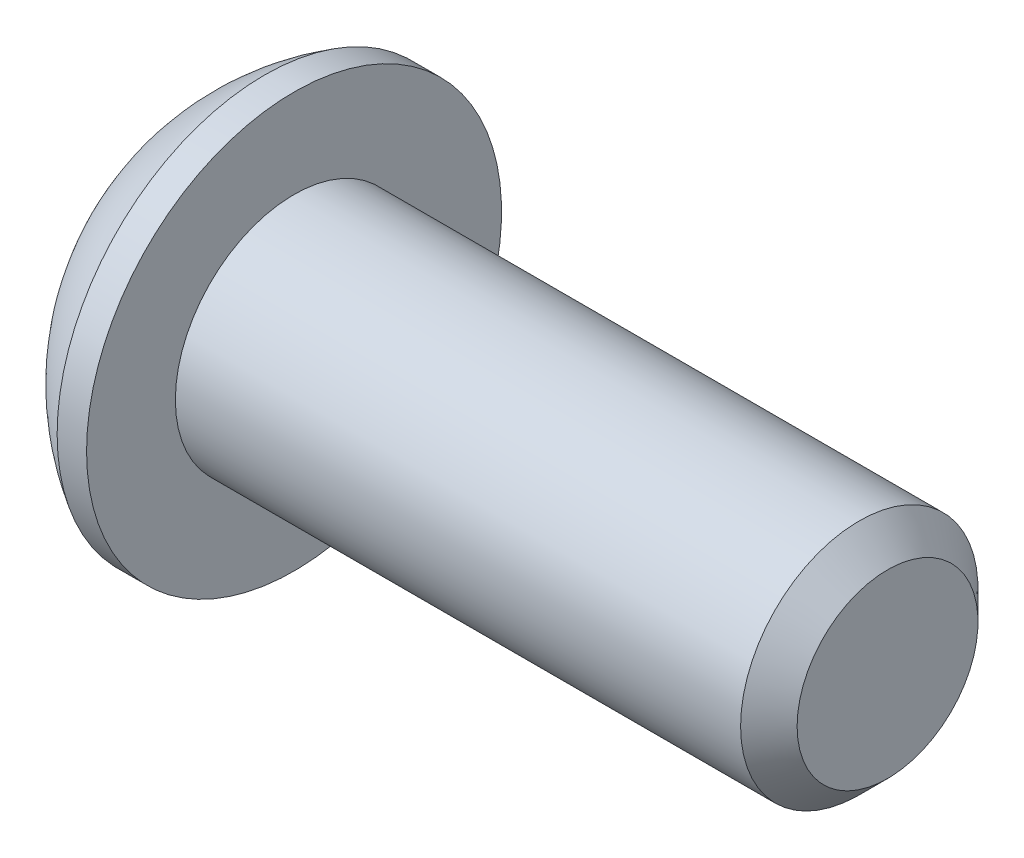
ISO-10303-21;
HEADER;
FILE_DESCRIPTION(('STEP AP214'),'2;1');
FILE_NAME('part.step','',(''),(''),'','','');
FILE_SCHEMA(('AUTOMOTIVE_DESIGN { 1 0 10303 214 1 1 1 1 }'));
ENDSEC;
DATA;
#1=APPLICATION_CONTEXT('core data for automotive mechanical design processes');
#2=APPLICATION_PROTOCOL_DEFINITION('international standard','automotive_design',2000,#1);
#3=PRODUCT_CONTEXT('',#1,'mechanical');
#4=PRODUCT('Part','Part','',(#3));
#5=PRODUCT_RELATED_PRODUCT_CATEGORY('part','',(#4));
#6=PRODUCT_DEFINITION_FORMATION('','',#4);
#7=PRODUCT_DEFINITION_CONTEXT('part definition',#1,'design');
#8=PRODUCT_DEFINITION('design','',#6,#7);
#9=PRODUCT_DEFINITION_SHAPE('','',#8);
#10=(LENGTH_UNIT() NAMED_UNIT(*) SI_UNIT(.MILLI.,.METRE.));
#11=(NAMED_UNIT(*) PLANE_ANGLE_UNIT() SI_UNIT($,.RADIAN.));
#12=(NAMED_UNIT(*) SI_UNIT($,.STERADIAN.) SOLID_ANGLE_UNIT());
#13=UNCERTAINTY_MEASURE_WITH_UNIT(LENGTH_MEASURE(1.E-05),#10,'distance_accuracy_value','');
#14=(GEOMETRIC_REPRESENTATION_CONTEXT(3) GLOBAL_UNCERTAINTY_ASSIGNED_CONTEXT((#13)) GLOBAL_UNIT_ASSIGNED_CONTEXT((#10,
#11,#12)) REPRESENTATION_CONTEXT('',''));
#15=CARTESIAN_POINT('',(0.,0.,0.));
#16=DIRECTION('',(0.,0.,1.));
#17=DIRECTION('',(1.,0.,0.));
#18=AXIS2_PLACEMENT_3D('',#15,#16,#17);
#19=CARTESIAN_POINT('',(0.,0.,0.));
#20=DIRECTION('',(-1.,0.,0.));
#21=DIRECTION('',(0.,0.,1.));
#22=AXIS2_PLACEMENT_3D('',#19,#20,#21);
#23=PLANE('',#22);
#24=CARTESIAN_POINT('',(0.,0.,0.));
#25=DIRECTION('',(-1.,0.,0.));
#26=DIRECTION('',(0.,0.,1.));
#27=AXIS2_PLACEMENT_3D('',#24,#25,#26);
#28=CIRCLE('',#27,2.77495);
#29=CARTESIAN_POINT('',(0.,2.77495,0.));
#30=VERTEX_POINT('',#29);
#31=EDGE_CURVE('E11',#30,#30,#28,.T.);
#32=ORIENTED_EDGE('',*,*,#31,.T.);
#33=EDGE_LOOP('',(#32));
#34=FACE_BOUND('',#33,.T.);
#35=DIRECTION('',(0.,-1.,0.));
#36=VECTOR('',#35,1.);
#37=CARTESIAN_POINT('',(0.,-1.14384635331849,1.9812));
#38=LINE('',#37,#36);
#39=CARTESIAN_POINT('',(0.,1.14384635331849,1.9812));
#40=VERTEX_POINT('',#39);
#41=CARTESIAN_POINT('',(0.,-1.14384635331849,1.9812));
#42=VERTEX_POINT('',#41);
#43=EDGE_CURVE('E49',#40,#42,#38,.T.);
#44=ORIENTED_EDGE('',*,*,#43,.T.);
#45=DIRECTION('',(0.,-0.5,-0.866025403784439));
#46=VECTOR('',#45,1.);
#47=CARTESIAN_POINT('',(0.,-2.28769270663697,0.));
#48=LINE('',#47,#46);
#49=CARTESIAN_POINT('',(0.,-2.28769270663697,0.));
#50=VERTEX_POINT('',#49);
#51=EDGE_CURVE('E367',#42,#50,#48,.T.);
#52=ORIENTED_EDGE('',*,*,#51,.T.);
#53=DIRECTION('',(0.,0.5,-0.866025403784439));
#54=VECTOR('',#53,1.);
#55=CARTESIAN_POINT('',(0.,-1.14384635331849,-1.9812));
#56=LINE('',#55,#54);
#57=CARTESIAN_POINT('',(0.,-1.14384635331849,-1.9812));
#58=VERTEX_POINT('',#57);
#59=EDGE_CURVE('E129',#50,#58,#56,.T.);
#60=ORIENTED_EDGE('',*,*,#59,.T.);
#61=DIRECTION('',(0.,1.,0.));
#62=VECTOR('',#61,1.);
#63=CARTESIAN_POINT('',(0.,1.14384635331849,-1.9812));
#64=LINE('',#63,#62);
#65=CARTESIAN_POINT('',(0.,1.14384635331849,-1.9812));
#66=VERTEX_POINT('',#65);
#67=EDGE_CURVE('E370',#58,#66,#64,.T.);
#68=ORIENTED_EDGE('',*,*,#67,.T.);
#69=DIRECTION('',(0.,0.5,0.866025403784439));
#70=VECTOR('',#69,1.);
#71=CARTESIAN_POINT('',(0.,2.28769270663697,0.));
#72=LINE('',#71,#70);
#73=CARTESIAN_POINT('',(0.,2.28769270663697,0.));
#74=VERTEX_POINT('',#73);
#75=EDGE_CURVE('E372',#66,#74,#72,.T.);
#76=ORIENTED_EDGE('',*,*,#75,.T.);
#77=DIRECTION('',(0.,-0.5,0.866025403784439));
#78=VECTOR('',#77,1.);
#79=CARTESIAN_POINT('',(0.,1.14384635331849,1.9812));
#80=LINE('',#79,#78);
#81=EDGE_CURVE('E374',#74,#40,#80,.T.);
#82=ORIENTED_EDGE('',*,*,#81,.T.);
#83=EDGE_LOOP('',(#44,#52,#60,#68,#76,#82));
#84=FACE_BOUND('',#83,.T.);
#85=ADVANCED_FACE('F35',(#34,#84),#23,.T.);
#86=CARTESIAN_POINT('',(5.78512506188119,0.,0.));
#87=DIRECTION('',(-1.,0.,0.));
#88=DIRECTION('',(0.,1.,0.));
#89=AXIS2_PLACEMENT_3D('',#86,#87,#88);
#90=SPHERICAL_SURFACE('',#89,6.41623094067739);
#91=CARTESIAN_POINT('',(2.5654,0.,0.));
#92=DIRECTION('',(-1.,0.,0.));
#93=DIRECTION('',(0.,0.,1.));
#94=AXIS2_PLACEMENT_3D('',#91,#92,#93);
#95=CIRCLE('',#94,5.5499);
#96=CARTESIAN_POINT('',(2.5654,5.5499,0.));
#97=VERTEX_POINT('',#96);
#98=EDGE_CURVE('E42',#97,#97,#95,.T.);
#99=CARTESIAN_POINT('',(2.5654,5.5499,0.));
#100=CARTESIAN_POINT('',(2.53083708566419,5.52984868712258,0.));
#101=CARTESIAN_POINT('',(2.49646152825914,5.50947442663449,0.));
#102=CARTESIAN_POINT('',(2.42809701945272,5.4680872977392,0.));
#103=CARTESIAN_POINT('',(2.39410806805135,5.447074429332,0.));
#104=CARTESIAN_POINT('',(2.32652866339446,5.40441737190071,0.));
#105=CARTESIAN_POINT('',(2.29293821013895,5.38277318287661,0.));
#106=CARTESIAN_POINT('',(2.22616751866502,5.33886105159856,0.));
#107=CARTESIAN_POINT('',(2.19298728044662,5.3165931093446,0.));
#108=CARTESIAN_POINT('',(2.12704860244366,5.27144124070729,0.));
#109=CARTESIAN_POINT('',(2.09429016265912,5.24855731432393,0.));
#110=CARTESIAN_POINT('',(2.02920651509859,5.20218146582175,0.));
#111=CARTESIAN_POINT('',(1.99688130732261,5.17868954370292,0.));
#112=CARTESIAN_POINT('',(1.93267540683267,5.13110590319174,0.));
#113=CARTESIAN_POINT('',(1.90079471411871,5.10701418479938,0.));
#114=CARTESIAN_POINT('',(1.83748897146475,5.05823936086598,0.));
#115=CARTESIAN_POINT('',(1.80606392152475,5.03355625532495,0.));
#116=CARTESIAN_POINT('',(1.74368043314138,4.98360727255644,0.));
#117=CARTESIAN_POINT('',(1.71272199469802,4.95834139532897,0.));
#118=CARTESIAN_POINT('',(1.65128253514951,4.90723568808467,0.));
#119=CARTESIAN_POINT('',(1.62080151404435,4.88139585806785,0.));
#120=CARTESIAN_POINT('',(1.56032752837792,4.82915126447052,0.));
#121=CARTESIAN_POINT('',(1.53033456381665,4.80274650089003,0.));
#122=CARTESIAN_POINT('',(1.4708471600897,4.74938125657909,0.));
#123=CARTESIAN_POINT('',(1.44135272092403,4.72242077584864,0.));
#124=CARTESIAN_POINT('',(1.38287266283316,4.66795350762059,0.));
#125=CARTESIAN_POINT('',(1.35388704390797,4.64044672012299,0.));
#126=CARTESIAN_POINT('',(1.29643474354244,4.58489643942841,0.));
#127=CARTESIAN_POINT('',(1.26796806210209,4.55685294623144,0.));
#128=CARTESIAN_POINT('',(1.21156357281885,4.50023904253955,0.));
#129=CARTESIAN_POINT('',(1.18362576497595,4.47166863204464,0.));
#130=CARTESIAN_POINT('',(1.12828877440023,4.41401086607543,0.));
#131=CARTESIAN_POINT('',(1.10088959166741,4.38492351060113,0.));
#132=CARTESIAN_POINT('',(1.04663941482087,4.32624200742801,0.));
#133=CARTESIAN_POINT('',(1.01978842070714,4.2966478597292,0.));
#134=CARTESIAN_POINT('',(0.966643993266069,4.2369631017545,0.));
#135=CARTESIAN_POINT('',(0.94035055993872,4.20687249147862,0.));
#136=CARTESIAN_POINT('',(0.888330431624668,4.14620531128432,0.));
#137=CARTESIAN_POINT('',(0.862603736637966,4.11562874136591,0.));
#138=CARTESIAN_POINT('',(0.811726064743087,4.05400031444217,0.));
#139=CARTESIAN_POINT('',(0.786575087834911,4.02294845743684,0.));
#140=CARTESIAN_POINT('',(0.736857630884291,3.96038029479081,0.));
#141=CARTESIAN_POINT('',(0.712291150841848,3.9288639891501,0.));
#142=CARTESIAN_POINT('',(0.6637512623949,3.8653779297977,0.));
#143=CARTESIAN_POINT('',(0.639777853990396,3.833408176086,0.));
#144=CARTESIAN_POINT('',(0.592432476584127,3.76902637942894,0.));
#145=CARTESIAN_POINT('',(0.569060507582362,3.73661433648358,0.));
#146=CARTESIAN_POINT('',(0.522926166816147,3.67135927457555,0.));
#147=CARTESIAN_POINT('',(0.500163795051696,3.63851625561289,0.));
#148=CARTESIAN_POINT('',(0.455256593824864,3.57241070531295,0.));
#149=CARTESIAN_POINT('',(0.433111764362482,3.53914817397566,0.));
#150=CARTESIAN_POINT('',(0.389447377232278,3.47221520900886,0.));
#151=CARTESIAN_POINT('',(0.367927819564456,3.43854477537934,0.));
#152=CARTESIAN_POINT('',(0.325521487354906,3.37080775824281,0.));
#153=CARTESIAN_POINT('',(0.304634712813178,3.3367411747358,0.));
#154=CARTESIAN_POINT('',(0.263501236996927,3.26822374869429,0.));
#155=CARTESIAN_POINT('',(0.243254535722403,3.23377290615979,0.));
#156=CARTESIAN_POINT('',(0.203408274368182,3.16449898643303,0.));
#157=CARTESIAN_POINT('',(0.183808714288484,3.12967590924077,0.));
#158=CARTESIAN_POINT('',(0.14526357289266,3.05966967674634,0.));
#159=CARTESIAN_POINT('',(0.126317991576534,3.02448652144419,0.));
#160=CARTESIAN_POINT('',(0.089087433723099,2.95377240655615,0.));
#161=CARTESIAN_POINT('',(0.0708024571857911,2.91824144697028,0.));
#162=CARTESIAN_POINT('',(0.0348994419493881,2.84684415010637,0.));
#163=CARTESIAN_POINT('',(0.017281403250293,2.81097781282834,0.));
#164=CARTESIAN_POINT('',(0.,2.77495,0.));
#165=B_SPLINE_CURVE_WITH_KNOTS('',3,(#99,#100,#101,#102,#103,#104,#105,#106,#107,#108,#109,#110,
#111,#112,#113,#114,#115,#116,#117,#118,#119,#120,#121,#122,#123,#124,#125,#126,#127,#128,#129,
#130,#131,#132,#133,#134,#135,#136,#137,#138,#139,#140,#141,#142,#143,#144,#145,#146,#147,#148,
#149,#150,#151,#152,#153,#154,#155,#156,#157,#158,#159,#160,#161,#162,#163,#164),.UNSPECIFIED.,
.F.,.F.,(4,2,2,2,2,2,2,2,2,2,2,2,2,2,2,2,2,2,2,2,2,2,2,2,2,2,2,2,2,2,2,2,4),(0.,
0.119872570538484,0.239745141076968,0.359617711615453,0.479490282153937,0.599362852692421,
0.719235423230905,0.83910799376939,0.958980564307873,1.07885313484636,1.19872570538484,
1.31859827592333,1.43847084646181,1.55834341700029,1.67821598753878,1.79808855807726,
1.91796112861575,2.03783369915423,2.15770626969271,2.2775788402312,2.39745141076968,
2.51732398130817,2.63719655184665,2.75706912238513,2.87694169292362,2.9968142634621,
3.11668683400059,3.23655940453907,3.35643197507756,3.47630454561604,3.59617711615452,
3.71604968669301,3.83592225723149),.UNSPECIFIED.);
#166=EDGE_CURVE('BSEAM156',#97,#30,#165,.T.);
#167=ORIENTED_EDGE('',*,*,#98,.T.);
#168=ORIENTED_EDGE('',*,*,#31,.F.);
#169=ORIENTED_EDGE('',*,*,#166,.T.);
#170=ORIENTED_EDGE('',*,*,#166,.F.);
#171=EDGE_LOOP('',(#167,#169,#168,#170));
#172=FACE_BOUND('',#171,.T.);
#173=ADVANCED_FACE('F156',(#172),#90,.T.);
#174=CARTESIAN_POINT('',(0.,0.,0.));
#175=DIRECTION('',(-1.,0.,0.));
#176=DIRECTION('',(0.,0.,1.));
#177=AXIS2_PLACEMENT_3D('',#174,#175,#176);
#178=CYLINDRICAL_SURFACE('',#177,5.5499);
#179=ORIENTED_EDGE('',*,*,#98,.F.);
#180=EDGE_LOOP('',(#179));
#181=FACE_BOUND('',#180,.T.);
#182=CARTESIAN_POINT('',(3.3528,0.,0.));
#183=DIRECTION('',(-1.,0.,0.));
#184=DIRECTION('',(0.,0.,1.));
#185=AXIS2_PLACEMENT_3D('',#182,#183,#184);
#186=CIRCLE('',#185,5.5499);
#187=CARTESIAN_POINT('',(3.3528,0.,5.5499));
#188=VERTEX_POINT('',#187);
#189=EDGE_CURVE('E151',#188,#188,#186,.T.);
#190=ORIENTED_EDGE('',*,*,#189,.T.);
#191=EDGE_LOOP('',(#190));
#192=FACE_BOUND('',#191,.T.);
#193=ADVANCED_FACE('F159',(#181,#192),#178,.T.);
#194=CARTESIAN_POINT('',(3.3528,3.17499999999999,0.));
#195=DIRECTION('',(-1.,0.,0.));
#196=DIRECTION('',(0.,0.,1.));
#197=AXIS2_PLACEMENT_3D('',#194,#195,#196);
#198=PLANE('',#197);
#199=ORIENTED_EDGE('',*,*,#189,.F.);
#200=EDGE_LOOP('',(#199));
#201=FACE_BOUND('',#200,.T.);
#202=CARTESIAN_POINT('',(3.3528,0.,0.));
#203=DIRECTION('',(-1.,0.,0.));
#204=DIRECTION('',(0.,0.,1.));
#205=AXIS2_PLACEMENT_3D('',#202,#203,#204);
#206=CIRCLE('',#205,3.17499999999999);
#207=CARTESIAN_POINT('',(3.3528,0.,3.17499999999999));
#208=VERTEX_POINT('',#207);
#209=EDGE_CURVE('E148',#208,#208,#206,.T.);
#210=ORIENTED_EDGE('',*,*,#209,.T.);
#211=EDGE_LOOP('',(#210));
#212=FACE_BOUND('',#211,.T.);
#213=ADVANCED_FACE('F162',(#201,#212),#198,.F.);
#214=CARTESIAN_POINT('',(0.,0.,0.));
#215=DIRECTION('',(-1.,0.,0.));
#216=DIRECTION('',(0.,0.,1.));
#217=AXIS2_PLACEMENT_3D('',#214,#215,#216);
#218=CYLINDRICAL_SURFACE('',#217,3.175);
#219=ORIENTED_EDGE('',*,*,#209,.F.);
#220=EDGE_LOOP('',(#219));
#221=FACE_BOUND('',#220,.T.);
#222=CARTESIAN_POINT('',(18.47215,0.,0.));
#223=DIRECTION('',(-1.,0.,0.));
#224=DIRECTION('',(0.,0.,1.));
#225=AXIS2_PLACEMENT_3D('',#222,#223,#224);
#226=CIRCLE('',#225,3.175);
#227=CARTESIAN_POINT('',(18.47215,0.,3.175));
#228=VERTEX_POINT('',#227);
#229=EDGE_CURVE('E145',#228,#228,#226,.T.);
#230=ORIENTED_EDGE('',*,*,#229,.T.);
#231=EDGE_LOOP('',(#230));
#232=FACE_BOUND('',#231,.T.);
#233=ADVANCED_FACE('F168',(#221,#232),#218,.T.);
#234=CARTESIAN_POINT('',(19.2278,0.,0.));
#235=DIRECTION('',(-1.,0.,0.));
#236=DIRECTION('',(0.,0.,1.));
#237=AXIS2_PLACEMENT_3D('',#234,#235,#236);
#238=CONICAL_SURFACE('',#237,2.41935,0.78539816339744);
#239=ORIENTED_EDGE('',*,*,#229,.F.);
#240=EDGE_LOOP('',(#239));
#241=FACE_BOUND('',#240,.T.);
#242=CARTESIAN_POINT('',(19.2278,0.,0.));
#243=DIRECTION('',(-1.,0.,0.));
#244=DIRECTION('',(0.,0.,1.));
#245=AXIS2_PLACEMENT_3D('',#242,#243,#244);
#246=CIRCLE('',#245,2.41935);
#247=CARTESIAN_POINT('',(19.2278,0.,2.41935));
#248=VERTEX_POINT('',#247);
#249=EDGE_CURVE('E141',#248,#248,#246,.T.);
#250=ORIENTED_EDGE('',*,*,#249,.T.);
#251=EDGE_LOOP('',(#250));
#252=FACE_BOUND('',#251,.T.);
#253=ADVANCED_FACE('F174',(#241,#252),#238,.T.);
#254=CARTESIAN_POINT('',(19.2278,0.,0.));
#255=DIRECTION('',(-1.,0.,0.));
#256=DIRECTION('',(0.,0.,1.));
#257=AXIS2_PLACEMENT_3D('',#254,#255,#256);
#258=PLANE('',#257);
#259=ORIENTED_EDGE('',*,*,#249,.F.);
#260=EDGE_LOOP('',(#259));
#261=FACE_BOUND('',#260,.T.);
#262=ADVANCED_FACE('F180',(#261),#258,.F.);
#263=CARTESIAN_POINT('',(2.2098,-2.28769270663697,0.));
#264=DIRECTION('',(0.,0.866025403784439,-0.5));
#265=DIRECTION('',(0.,0.5,0.866025403784439));
#266=AXIS2_PLACEMENT_3D('',#263,#264,#265);
#267=PLANE('',#266);
#268=DIRECTION('',(0.,-0.5,-0.866025403784439));
#269=VECTOR('',#268,1.);
#270=CARTESIAN_POINT('',(2.2098,-2.28769270663697,0.));
#271=LINE('',#270,#269);
#272=CARTESIAN_POINT('',(2.2098,-1.14384635331849,1.9812));
#273=VERTEX_POINT('',#272);
#274=CARTESIAN_POINT('',(2.2098,-1.71576952997773,0.9906));
#275=VERTEX_POINT('',#274);
#276=EDGE_CURVE('E115',#273,#275,#271,.T.);
#277=ORIENTED_EDGE('',*,*,#276,.T.);
#278=CARTESIAN_POINT('',(2.2098,-2.28769270663697,0.));
#279=VERTEX_POINT('',#278);
#280=EDGE_CURVE('E110',#275,#279,#271,.T.);
#281=ORIENTED_EDGE('',*,*,#280,.T.);
#282=DIRECTION('',(-1.,0.,0.));
#283=VECTOR('',#282,1.);
#284=CARTESIAN_POINT('',(2.2098,-2.28769270663697,0.));
#285=LINE('',#284,#283);
#286=EDGE_CURVE('E112',#279,#50,#285,.T.);
#287=ORIENTED_EDGE('',*,*,#286,.T.);
#288=ORIENTED_EDGE('',*,*,#51,.F.);
#289=DIRECTION('',(-1.,0.,0.));
#290=VECTOR('',#289,1.);
#291=CARTESIAN_POINT('',(2.2098,-1.14384635331849,1.9812));
#292=LINE('',#291,#290);
#293=EDGE_CURVE('E362',#273,#42,#292,.T.);
#294=ORIENTED_EDGE('',*,*,#293,.F.);
#295=EDGE_LOOP('',(#277,#281,#287,#288,#294));
#296=FACE_BOUND('',#295,.T.);
#297=ADVANCED_FACE('F111',(#296),#267,.T.);
#298=CARTESIAN_POINT('',(2.2098,-1.14384635331849,-1.9812));
#299=DIRECTION('',(0.,0.866025403784439,0.5));
#300=DIRECTION('',(0.,-0.5,0.866025403784439));
#301=AXIS2_PLACEMENT_3D('',#298,#299,#300);
#302=PLANE('',#301);
#303=DIRECTION('',(0.,0.5,-0.866025403784439));
#304=VECTOR('',#303,1.);
#305=CARTESIAN_POINT('',(2.2098,-1.14384635331849,-1.9812));
#306=LINE('',#305,#304);
#307=CARTESIAN_POINT('',(2.2098,-1.71576952997773,-0.9906));
#308=VERTEX_POINT('',#307);
#309=EDGE_CURVE('E57',#279,#308,#306,.T.);
#310=ORIENTED_EDGE('',*,*,#309,.T.);
#311=CARTESIAN_POINT('',(2.2098,-1.14384635331849,-1.9812));
#312=VERTEX_POINT('',#311);
#313=EDGE_CURVE('E124',#308,#312,#306,.T.);
#314=ORIENTED_EDGE('',*,*,#313,.T.);
#315=DIRECTION('',(-1.,0.,0.));
#316=VECTOR('',#315,1.);
#317=CARTESIAN_POINT('',(2.2098,-1.14384635331849,-1.9812));
#318=LINE('',#317,#316);
#319=EDGE_CURVE('E131',#312,#58,#318,.T.);
#320=ORIENTED_EDGE('',*,*,#319,.T.);
#321=ORIENTED_EDGE('',*,*,#59,.F.);
#322=ORIENTED_EDGE('',*,*,#286,.F.);
#323=EDGE_LOOP('',(#310,#314,#320,#321,#322));
#324=FACE_BOUND('',#323,.T.);
#325=ADVANCED_FACE('F127',(#324),#302,.T.);
#326=CARTESIAN_POINT('',(2.2098,1.14384635331849,-1.9812));
#327=DIRECTION('',(0.,0.,1.));
#328=DIRECTION('',(1.,0.,0.));
#329=AXIS2_PLACEMENT_3D('',#326,#327,#328);
#330=PLANE('',#329);
#331=DIRECTION('',(0.,1.,0.));
#332=VECTOR('',#331,1.);
#333=CARTESIAN_POINT('',(2.2098,1.14384635331849,-1.9812));
#334=LINE('',#333,#332);
#335=CARTESIAN_POINT('',(2.2098,0.,-1.9812));
#336=VERTEX_POINT('',#335);
#337=EDGE_CURVE('E392',#312,#336,#334,.T.);
#338=ORIENTED_EDGE('',*,*,#337,.T.);
#339=CARTESIAN_POINT('',(2.2098,1.14384635331849,-1.9812));
#340=VERTEX_POINT('',#339);
#341=EDGE_CURVE('E123',#336,#340,#334,.T.);
#342=ORIENTED_EDGE('',*,*,#341,.T.);
#343=DIRECTION('',(-1.,0.,0.));
#344=VECTOR('',#343,1.);
#345=CARTESIAN_POINT('',(2.2098,1.14384635331849,-1.9812));
#346=LINE('',#345,#344);
#347=EDGE_CURVE('E136',#340,#66,#346,.T.);
#348=ORIENTED_EDGE('',*,*,#347,.T.);
#349=ORIENTED_EDGE('',*,*,#67,.F.);
#350=ORIENTED_EDGE('',*,*,#319,.F.);
#351=EDGE_LOOP('',(#338,#342,#348,#349,#350));
#352=FACE_BOUND('',#351,.T.);
#353=ADVANCED_FACE('F241',(#352),#330,.T.);
#354=CARTESIAN_POINT('',(2.2098,2.28769270663697,0.));
#355=DIRECTION('',(0.,-0.866025403784439,0.5));
#356=DIRECTION('',(0.,-0.5,-0.866025403784439));
#357=AXIS2_PLACEMENT_3D('',#354,#355,#356);
#358=PLANE('',#357);
#359=DIRECTION('',(0.,0.5,0.866025403784439));
#360=VECTOR('',#359,1.);
#361=CARTESIAN_POINT('',(2.2098,2.28769270663697,0.));
#362=LINE('',#361,#360);
#363=CARTESIAN_POINT('',(2.2098,1.71576952997773,-0.990600000000001));
#364=VERTEX_POINT('',#363);
#365=EDGE_CURVE('E396',#340,#364,#362,.T.);
#366=ORIENTED_EDGE('',*,*,#365,.T.);
#367=CARTESIAN_POINT('',(2.2098,2.28769270663697,0.));
#368=VERTEX_POINT('',#367);
#369=EDGE_CURVE('E394',#364,#368,#362,.T.);
#370=ORIENTED_EDGE('',*,*,#369,.T.);
#371=DIRECTION('',(-1.,0.,0.));
#372=VECTOR('',#371,1.);
#373=CARTESIAN_POINT('',(2.2098,2.28769270663697,0.));
#374=LINE('',#373,#372);
#375=EDGE_CURVE('E378',#368,#74,#374,.T.);
#376=ORIENTED_EDGE('',*,*,#375,.T.);
#377=ORIENTED_EDGE('',*,*,#75,.F.);
#378=ORIENTED_EDGE('',*,*,#347,.F.);
#379=EDGE_LOOP('',(#366,#370,#376,#377,#378));
#380=FACE_BOUND('',#379,.T.);
#381=ADVANCED_FACE('F250',(#380),#358,.T.);
#382=CARTESIAN_POINT('',(2.2098,1.14384635331849,1.9812));
#383=DIRECTION('',(0.,-0.866025403784439,-0.5));
#384=DIRECTION('',(0.,0.5,-0.866025403784439));
#385=AXIS2_PLACEMENT_3D('',#382,#383,#384);
#386=PLANE('',#385);
#387=DIRECTION('',(0.,-0.5,0.866025403784439));
#388=VECTOR('',#387,1.);
#389=CARTESIAN_POINT('',(2.2098,1.14384635331849,1.9812));
#390=LINE('',#389,#388);
#391=CARTESIAN_POINT('',(2.2098,1.71576952997773,0.990600000000001));
#392=VERTEX_POINT('',#391);
#393=EDGE_CURVE('E357',#368,#392,#390,.T.);
#394=ORIENTED_EDGE('',*,*,#393,.T.);
#395=CARTESIAN_POINT('',(2.2098,1.14384635331849,1.9812));
#396=VERTEX_POINT('',#395);
#397=EDGE_CURVE('E353',#392,#396,#390,.T.);
#398=ORIENTED_EDGE('',*,*,#397,.T.);
#399=DIRECTION('',(-1.,0.,0.));
#400=VECTOR('',#399,1.);
#401=CARTESIAN_POINT('',(2.2098,1.14384635331849,1.9812));
#402=LINE('',#401,#400);
#403=EDGE_CURVE('E361',#396,#40,#402,.T.);
#404=ORIENTED_EDGE('',*,*,#403,.T.);
#405=ORIENTED_EDGE('',*,*,#81,.F.);
#406=ORIENTED_EDGE('',*,*,#375,.F.);
#407=EDGE_LOOP('',(#394,#398,#404,#405,#406));
#408=FACE_BOUND('',#407,.T.);
#409=ADVANCED_FACE('F260',(#408),#386,.T.);
#410=CARTESIAN_POINT('',(2.2098,-1.14384635331849,1.9812));
#411=DIRECTION('',(0.,0.,-1.));
#412=DIRECTION('',(0.,1.,0.));
#413=AXIS2_PLACEMENT_3D('',#410,#411,#412);
#414=PLANE('',#413);
#415=DIRECTION('',(0.,-1.,0.));
#416=VECTOR('',#415,1.);
#417=CARTESIAN_POINT('',(2.2098,-1.14384635331849,1.9812));
#418=LINE('',#417,#416);
#419=CARTESIAN_POINT('',(2.2098,0.,1.9812));
#420=VERTEX_POINT('',#419);
#421=EDGE_CURVE('E352',#396,#420,#418,.T.);
#422=ORIENTED_EDGE('',*,*,#421,.T.);
#423=EDGE_CURVE('E355',#420,#273,#418,.T.);
#424=ORIENTED_EDGE('',*,*,#423,.T.);
#425=ORIENTED_EDGE('',*,*,#293,.T.);
#426=ORIENTED_EDGE('',*,*,#43,.F.);
#427=ORIENTED_EDGE('',*,*,#403,.F.);
#428=EDGE_LOOP('',(#422,#424,#425,#426,#427));
#429=FACE_BOUND('',#428,.T.);
#430=ADVANCED_FACE('F270',(#429),#414,.T.);
#431=CARTESIAN_POINT('',(2.2098,-2.28769270663697,0.));
#432=DIRECTION('',(1.,0.,0.));
#433=DIRECTION('',(0.,0.,-1.));
#434=AXIS2_PLACEMENT_3D('',#431,#432,#433);
#435=PLANE('',#434);
#436=CARTESIAN_POINT('',(2.2098,0.,0.));
#437=DIRECTION('',(-1.,0.,0.));
#438=DIRECTION('',(0.,0.,1.));
#439=AXIS2_PLACEMENT_3D('',#436,#437,#438);
#440=CIRCLE('',#439,1.9812);
#441=EDGE_CURVE('E399',#364,#336,#440,.T.);
#442=ORIENTED_EDGE('',*,*,#441,.F.);
#443=ORIENTED_EDGE('',*,*,#365,.F.);
#444=ORIENTED_EDGE('',*,*,#341,.F.);
#445=EDGE_LOOP('',(#442,#443,#444));
#446=FACE_BOUND('',#445,.T.);
#447=ADVANCED_FACE('F280',(#446),#435,.F.);
#448=EDGE_CURVE('E142',#392,#364,#440,.T.);
#449=ORIENTED_EDGE('',*,*,#448,.F.);
#450=ORIENTED_EDGE('',*,*,#393,.F.);
#451=ORIENTED_EDGE('',*,*,#369,.F.);
#452=EDGE_LOOP('',(#449,#450,#451));
#453=FACE_BOUND('',#452,.T.);
#454=ADVANCED_FACE('F290',(#453),#435,.F.);
#455=EDGE_CURVE('E135',#420,#392,#440,.T.);
#456=ORIENTED_EDGE('',*,*,#455,.F.);
#457=ORIENTED_EDGE('',*,*,#421,.F.);
#458=ORIENTED_EDGE('',*,*,#397,.F.);
#459=EDGE_LOOP('',(#456,#457,#458));
#460=FACE_BOUND('',#459,.T.);
#461=ADVANCED_FACE('F301',(#460),#435,.F.);
#462=EDGE_CURVE('E130',#275,#420,#440,.T.);
#463=ORIENTED_EDGE('',*,*,#462,.F.);
#464=ORIENTED_EDGE('',*,*,#276,.F.);
#465=ORIENTED_EDGE('',*,*,#423,.F.);
#466=EDGE_LOOP('',(#463,#464,#465));
#467=FACE_BOUND('',#466,.T.);
#468=ADVANCED_FACE('F310',(#467),#435,.F.);
#469=EDGE_CURVE('E121',#308,#275,#440,.T.);
#470=ORIENTED_EDGE('',*,*,#469,.F.);
#471=ORIENTED_EDGE('',*,*,#309,.F.);
#472=ORIENTED_EDGE('',*,*,#280,.F.);
#473=EDGE_LOOP('',(#470,#471,#472));
#474=FACE_BOUND('',#473,.T.);
#475=ADVANCED_FACE('F120',(#474),#435,.F.);
#476=EDGE_CURVE('E393',#336,#308,#440,.T.);
#477=ORIENTED_EDGE('',*,*,#476,.F.);
#478=ORIENTED_EDGE('',*,*,#337,.F.);
#479=ORIENTED_EDGE('',*,*,#313,.F.);
#480=EDGE_LOOP('',(#477,#478,#479));
#481=FACE_BOUND('',#480,.T.);
#482=ADVANCED_FACE('F293',(#481),#435,.F.);
#483=CARTESIAN_POINT('',(3.3536463533185,0.,0.));
#484=DIRECTION('',(-1.,0.,0.));
#485=DIRECTION('',(0.,0.,1.));
#486=AXIS2_PLACEMENT_3D('',#483,#484,#485);
#487=CONICAL_SURFACE('',#486,0.,1.04719755119659);
#488=ORIENTED_EDGE('',*,*,#455,.T.);
#489=ORIENTED_EDGE('',*,*,#448,.T.);
#490=ORIENTED_EDGE('',*,*,#441,.T.);
#491=ORIENTED_EDGE('',*,*,#476,.T.);
#492=ORIENTED_EDGE('',*,*,#469,.T.);
#493=ORIENTED_EDGE('',*,*,#462,.T.);
#494=EDGE_LOOP('',(#488,#489,#490,#491,#492,#493));
#495=FACE_BOUND('',#494,.T.);
#496=CARTESIAN_POINT('',(3.3536463533185,0.,0.));
#497=VERTEX_POINT('',#496);
#498=VERTEX_LOOP('',#497);
#499=FACE_BOUND('',#498,.T.);
#500=ADVANCED_FACE('F334',(#495,#499),#487,.F.);
#501=CLOSED_SHELL('',(#85,#173,#193,#213,#233,#253,#262,#297,#325,#353,#381,#409,#430,#447,#454,
#461,#468,#475,#482,#500));
#502=MANIFOLD_SOLID_BREP('B2',#501);
#503=ADVANCED_BREP_SHAPE_REPRESENTATION('',(#18,#502),#14);
#504=SHAPE_DEFINITION_REPRESENTATION(#9,#503);
ENDSEC;
END-ISO-10303-21;
